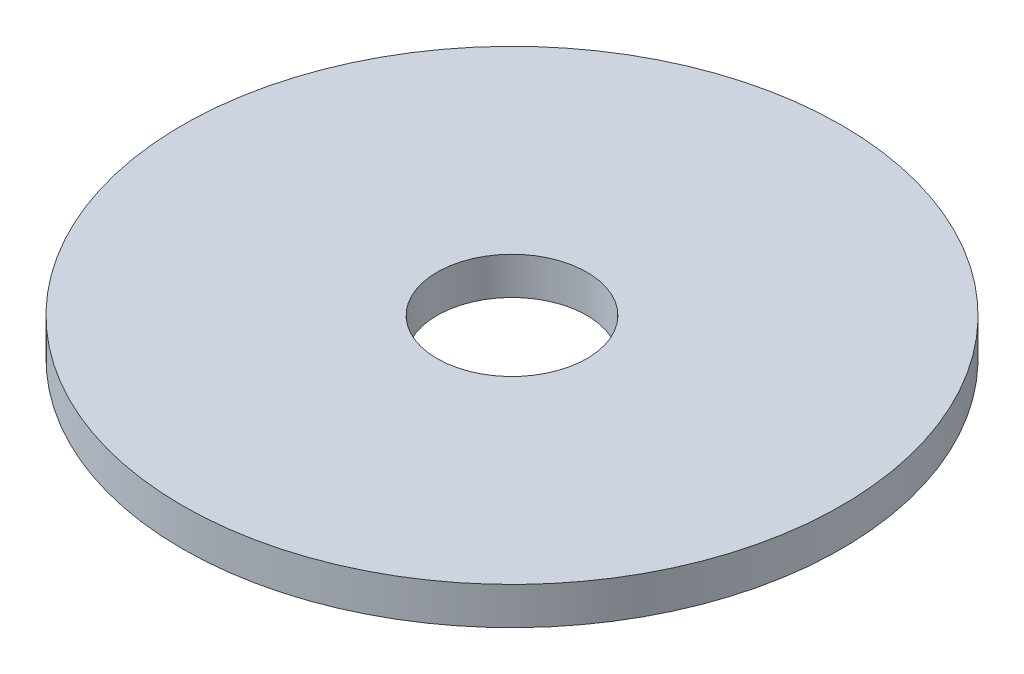
ISO-10303-21;
HEADER;
FILE_DESCRIPTION(('STEP AP214'),'2;1');
FILE_NAME('part.step','',(''),(''),'','','');
FILE_SCHEMA(('AUTOMOTIVE_DESIGN { 1 0 10303 214 1 1 1 1 }'));
ENDSEC;
DATA;
#1=APPLICATION_CONTEXT('core data for automotive mechanical design processes');
#2=APPLICATION_PROTOCOL_DEFINITION('international standard','automotive_design',2000,#1);
#3=PRODUCT_CONTEXT('',#1,'mechanical');
#4=PRODUCT('Part','Part','',(#3));
#5=PRODUCT_RELATED_PRODUCT_CATEGORY('part','',(#4));
#6=PRODUCT_DEFINITION_FORMATION('','',#4);
#7=PRODUCT_DEFINITION_CONTEXT('part definition',#1,'design');
#8=PRODUCT_DEFINITION('design','',#6,#7);
#9=PRODUCT_DEFINITION_SHAPE('','',#8);
#10=(LENGTH_UNIT() NAMED_UNIT(*) SI_UNIT(.MILLI.,.METRE.));
#11=(NAMED_UNIT(*) PLANE_ANGLE_UNIT() SI_UNIT($,.RADIAN.));
#12=(NAMED_UNIT(*) SI_UNIT($,.STERADIAN.) SOLID_ANGLE_UNIT());
#13=UNCERTAINTY_MEASURE_WITH_UNIT(LENGTH_MEASURE(1.E-05),#10,'distance_accuracy_value','');
#14=(GEOMETRIC_REPRESENTATION_CONTEXT(3) GLOBAL_UNCERTAINTY_ASSIGNED_CONTEXT((#13)) GLOBAL_UNIT_ASSIGNED_CONTEXT((#10,
#11,#12)) REPRESENTATION_CONTEXT('',''));
#15=CARTESIAN_POINT('',(0.,0.,0.));
#16=DIRECTION('',(0.,0.,1.));
#17=DIRECTION('',(1.,0.,0.));
#18=AXIS2_PLACEMENT_3D('',#15,#16,#17);
#19=CARTESIAN_POINT('',(0.,3.175,0.));
#20=DIRECTION('',(0.,-1.,0.));
#21=DIRECTION('',(0.,0.,-1.));
#22=AXIS2_PLACEMENT_3D('',#19,#20,#21);
#23=CYLINDRICAL_SURFACE('',#22,27.94);
#24=CARTESIAN_POINT('',(0.,3.175,0.));
#25=DIRECTION('',(0.,1.,0.));
#26=DIRECTION('',(0.,0.,1.));
#27=AXIS2_PLACEMENT_3D('',#24,#25,#26);
#28=CIRCLE('',#27,27.94);
#29=CARTESIAN_POINT('',(0.,3.175,27.94));
#30=VERTEX_POINT('',#29);
#31=EDGE_CURVE('E10',#30,#30,#28,.T.);
#32=ORIENTED_EDGE('',*,*,#31,.F.);
#33=EDGE_LOOP('',(#32));
#34=FACE_BOUND('',#33,.T.);
#35=CARTESIAN_POINT('',(0.,0.,0.));
#36=DIRECTION('',(0.,1.,0.));
#37=DIRECTION('',(0.,0.,1.));
#38=AXIS2_PLACEMENT_3D('',#35,#36,#37);
#39=CIRCLE('',#38,27.94);
#40=CARTESIAN_POINT('',(0.,0.,27.94));
#41=VERTEX_POINT('',#40);
#42=EDGE_CURVE('E34',#41,#41,#39,.T.);
#43=ORIENTED_EDGE('',*,*,#42,.T.);
#44=EDGE_LOOP('',(#43));
#45=FACE_BOUND('',#44,.T.);
#46=ADVANCED_FACE('F31',(#34,#45),#23,.T.);
#47=CARTESIAN_POINT('',(0.,3.175,0.));
#48=DIRECTION('',(0.,1.,0.));
#49=DIRECTION('',(0.,0.,1.));
#50=AXIS2_PLACEMENT_3D('',#47,#48,#49);
#51=PLANE('',#50);
#52=CARTESIAN_POINT('',(0.,3.175,0.));
#53=DIRECTION('',(0.,1.,0.));
#54=DIRECTION('',(0.,0.,1.));
#55=AXIS2_PLACEMENT_3D('',#52,#53,#54);
#56=CIRCLE('',#55,6.35);
#57=CARTESIAN_POINT('',(0.,3.175,6.35));
#58=VERTEX_POINT('',#57);
#59=EDGE_CURVE('E43',#58,#58,#56,.T.);
#60=ORIENTED_EDGE('',*,*,#59,.F.);
#61=EDGE_LOOP('',(#60));
#62=FACE_BOUND('',#61,.T.);
#63=ORIENTED_EDGE('',*,*,#31,.T.);
#64=EDGE_LOOP('',(#63));
#65=FACE_BOUND('',#64,.T.);
#66=ADVANCED_FACE('F58',(#62,#65),#51,.T.);
#67=CARTESIAN_POINT('',(0.,0.,0.));
#68=DIRECTION('',(0.,1.,0.));
#69=DIRECTION('',(0.,0.,1.));
#70=AXIS2_PLACEMENT_3D('',#67,#68,#69);
#71=PLANE('',#70);
#72=CARTESIAN_POINT('',(0.,0.,0.));
#73=DIRECTION('',(0.,1.,0.));
#74=DIRECTION('',(0.,0.,1.));
#75=AXIS2_PLACEMENT_3D('',#72,#73,#74);
#76=CIRCLE('',#75,6.35);
#77=CARTESIAN_POINT('',(0.,0.,6.35));
#78=VERTEX_POINT('',#77);
#79=EDGE_CURVE('E41',#78,#78,#76,.T.);
#80=ORIENTED_EDGE('',*,*,#79,.T.);
#81=EDGE_LOOP('',(#80));
#82=FACE_BOUND('',#81,.T.);
#83=ORIENTED_EDGE('',*,*,#42,.F.);
#84=EDGE_LOOP('',(#83));
#85=FACE_BOUND('',#84,.T.);
#86=ADVANCED_FACE('F49',(#82,#85),#71,.F.);
#87=CARTESIAN_POINT('',(0.,0.,0.));
#88=DIRECTION('',(0.,1.,0.));
#89=DIRECTION('',(0.,0.,1.));
#90=AXIS2_PLACEMENT_3D('',#87,#88,#89);
#91=CYLINDRICAL_SURFACE('',#90,6.35);
#92=ORIENTED_EDGE('',*,*,#79,.F.);
#93=EDGE_LOOP('',(#92));
#94=FACE_BOUND('',#93,.T.);
#95=ORIENTED_EDGE('',*,*,#59,.T.);
#96=EDGE_LOOP('',(#95));
#97=FACE_BOUND('',#96,.T.);
#98=ADVANCED_FACE('F52',(#94,#97),#91,.F.);
#99=CLOSED_SHELL('',(#46,#66,#86,#98));
#100=MANIFOLD_SOLID_BREP('B2',#99);
#101=ADVANCED_BREP_SHAPE_REPRESENTATION('',(#18,#100),#14);
#102=SHAPE_DEFINITION_REPRESENTATION(#9,#101);
ENDSEC;
END-ISO-10303-21;
